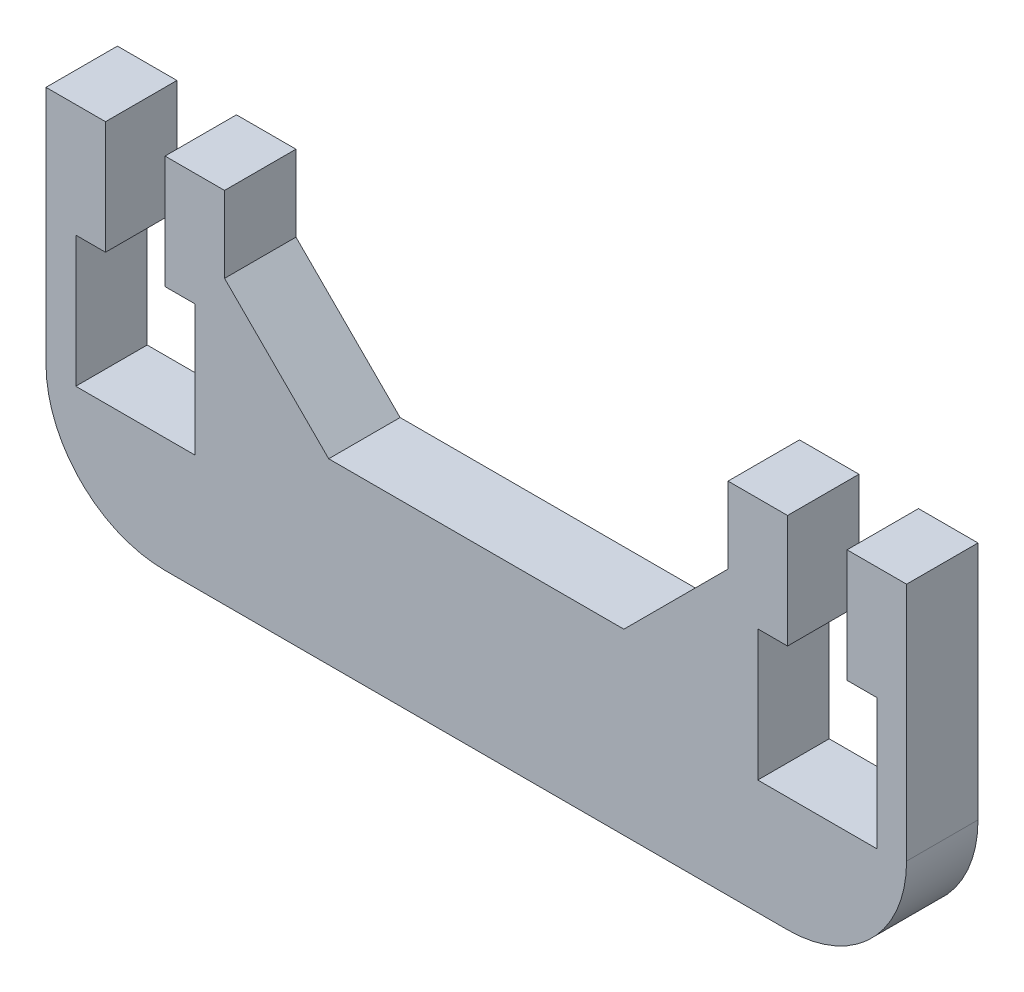
ISO-10303-21;
HEADER;
FILE_DESCRIPTION(('STEP AP214'),'2;1');
FILE_NAME('part.step','',(''),(''),'','','');
FILE_SCHEMA(('AUTOMOTIVE_DESIGN { 1 0 10303 214 1 1 1 1 }'));
ENDSEC;
DATA;
#1=APPLICATION_CONTEXT('core data for automotive mechanical design processes');
#2=APPLICATION_PROTOCOL_DEFINITION('international standard','automotive_design',2000,#1);
#3=PRODUCT_CONTEXT('',#1,'mechanical');
#4=PRODUCT('Part','Part','',(#3));
#5=PRODUCT_RELATED_PRODUCT_CATEGORY('part','',(#4));
#6=PRODUCT_DEFINITION_FORMATION('','',#4);
#7=PRODUCT_DEFINITION_CONTEXT('part definition',#1,'design');
#8=PRODUCT_DEFINITION('design','',#6,#7);
#9=PRODUCT_DEFINITION_SHAPE('','',#8);
#10=(LENGTH_UNIT() NAMED_UNIT(*) SI_UNIT(.MILLI.,.METRE.));
#11=(NAMED_UNIT(*) PLANE_ANGLE_UNIT() SI_UNIT($,.RADIAN.));
#12=(NAMED_UNIT(*) SI_UNIT($,.STERADIAN.) SOLID_ANGLE_UNIT());
#13=UNCERTAINTY_MEASURE_WITH_UNIT(LENGTH_MEASURE(1.E-05),#10,'distance_accuracy_value','');
#14=(GEOMETRIC_REPRESENTATION_CONTEXT(3) GLOBAL_UNCERTAINTY_ASSIGNED_CONTEXT((#13)) GLOBAL_UNIT_ASSIGNED_CONTEXT((#10,
#11,#12)) REPRESENTATION_CONTEXT('',''));
#15=CARTESIAN_POINT('',(0.,0.,0.));
#16=DIRECTION('',(0.,0.,1.));
#17=DIRECTION('',(1.,0.,0.));
#18=AXIS2_PLACEMENT_3D('',#15,#16,#17);
#19=CARTESIAN_POINT('',(0.,0.,6.));
#20=DIRECTION('',(0.,0.,-1.));
#21=DIRECTION('',(-1.,0.,0.));
#22=AXIS2_PLACEMENT_3D('',#19,#20,#21);
#23=PLANE('',#22);
#24=DIRECTION('',(0.,-1.,0.));
#25=VECTOR('',#24,1.);
#26=CARTESIAN_POINT('',(-10.,0.,6.));
#27=LINE('',#26,#25);
#28=CARTESIAN_POINT('',(-10.,15.15,6.));
#29=VERTEX_POINT('',#28);
#30=CARTESIAN_POINT('',(-10.,5.65,6.000005));
#31=VERTEX_POINT('',#30);
#32=EDGE_CURVE('E358',#29,#31,#27,.T.);
#33=ORIENTED_EDGE('',*,*,#32,.F.);
#34=DIRECTION('',(-1.,0.,0.));
#35=VECTOR('',#34,1.);
#36=CARTESIAN_POINT('',(-15.,15.15,6.));
#37=LINE('',#36,#35);
#38=CARTESIAN_POINT('',(-15.,15.15,6.));
#39=VERTEX_POINT('',#38);
#40=EDGE_CURVE('E285',#29,#39,#37,.T.);
#41=ORIENTED_EDGE('',*,*,#40,.T.);
#42=DIRECTION('',(0.,-1.,0.));
#43=VECTOR('',#42,1.);
#44=CARTESIAN_POINT('',(-15.,-15.,6.));
#45=LINE('',#44,#43);
#46=CARTESIAN_POINT('',(-15.,-5.,6.));
#47=VERTEX_POINT('',#46);
#48=EDGE_CURVE('E422',#39,#47,#45,.T.);
#49=ORIENTED_EDGE('',*,*,#48,.T.);
#50=CARTESIAN_POINT('',(-5.,-5.,6.));
#51=DIRECTION('',(0.,0.,-1.));
#52=DIRECTION('',(-1.,0.,0.));
#53=AXIS2_PLACEMENT_3D('',#50,#51,#52);
#54=CIRCLE('',#53,10.);
#55=CARTESIAN_POINT('',(-5.,-15.,6.));
#56=VERTEX_POINT('',#55);
#57=EDGE_CURVE('E341',#47,#56,#54,.F.);
#58=ORIENTED_EDGE('',*,*,#57,.T.);
#59=DIRECTION('',(1.,0.,0.));
#60=VECTOR('',#59,1.);
#61=CARTESIAN_POINT('',(-15.,-15.,6.));
#62=LINE('',#61,#60);
#63=CARTESIAN_POINT('',(47.3,-15.,6.));
#64=VERTEX_POINT('',#63);
#65=EDGE_CURVE('E419',#56,#64,#62,.T.);
#66=ORIENTED_EDGE('',*,*,#65,.T.);
#67=CARTESIAN_POINT('',(47.3,-5.,6.));
#68=DIRECTION('',(0.,0.,-1.));
#69=DIRECTION('',(-1.,0.,0.));
#70=AXIS2_PLACEMENT_3D('',#67,#68,#69);
#71=CIRCLE('',#70,10.);
#72=CARTESIAN_POINT('',(57.3,-5.,6.));
#73=VERTEX_POINT('',#72);
#74=EDGE_CURVE('E343',#64,#73,#71,.F.);
#75=ORIENTED_EDGE('',*,*,#74,.T.);
#76=DIRECTION('',(0.,1.,0.));
#77=VECTOR('',#76,1.);
#78=CARTESIAN_POINT('',(57.3,-15.,6.));
#79=LINE('',#78,#77);
#80=CARTESIAN_POINT('',(57.3,15.15,6.));
#81=VERTEX_POINT('',#80);
#82=EDGE_CURVE('E417',#73,#81,#79,.T.);
#83=ORIENTED_EDGE('',*,*,#82,.T.);
#84=DIRECTION('',(-1.,0.,0.));
#85=VECTOR('',#84,1.);
#86=CARTESIAN_POINT('',(42.3,15.15,6.));
#87=LINE('',#86,#85);
#88=CARTESIAN_POINT('',(52.3,15.15,6.));
#89=VERTEX_POINT('',#88);
#90=EDGE_CURVE('E412',#81,#89,#87,.T.);
#91=ORIENTED_EDGE('',*,*,#90,.T.);
#92=DIRECTION('',(0.,-1.,0.));
#93=VECTOR('',#92,1.);
#94=CARTESIAN_POINT('',(52.3,15.15,6.));
#95=LINE('',#94,#93);
#96=CARTESIAN_POINT('',(52.3,5.65,6.));
#97=VERTEX_POINT('',#96);
#98=EDGE_CURVE('E436',#89,#97,#95,.T.);
#99=ORIENTED_EDGE('',*,*,#98,.T.);
#100=DIRECTION('',(-1.,0.,0.));
#101=VECTOR('',#100,1.);
#102=CARTESIAN_POINT('',(0.,5.65000000000001,6.));
#103=LINE('',#102,#101);
#104=CARTESIAN_POINT('',(54.8,5.65,6.));
#105=VERTEX_POINT('',#104);
#106=EDGE_CURVE('E838',#105,#97,#103,.T.);
#107=ORIENTED_EDGE('',*,*,#106,.F.);
#108=DIRECTION('',(0.,-1.,0.));
#109=VECTOR('',#108,1.);
#110=CARTESIAN_POINT('',(54.8,0.,6.));
#111=LINE('',#110,#109);
#112=CARTESIAN_POINT('',(54.8,-5.35,6.));
#113=VERTEX_POINT('',#112);
#114=EDGE_CURVE('E856',#105,#113,#111,.T.);
#115=ORIENTED_EDGE('',*,*,#114,.T.);
#116=DIRECTION('',(-1.,0.,0.));
#117=VECTOR('',#116,1.);
#118=CARTESIAN_POINT('',(0.,-5.34999999999999,6.));
#119=LINE('',#118,#117);
#120=CARTESIAN_POINT('',(44.8,-5.35,6.));
#121=VERTEX_POINT('',#120);
#122=EDGE_CURVE('E853',#113,#121,#119,.T.);
#123=ORIENTED_EDGE('',*,*,#122,.T.);
#124=DIRECTION('',(0.,-1.,0.));
#125=VECTOR('',#124,1.);
#126=CARTESIAN_POINT('',(44.8,0.,6.));
#127=LINE('',#126,#125);
#128=CARTESIAN_POINT('',(44.8,5.65,6.));
#129=VERTEX_POINT('',#128);
#130=EDGE_CURVE('E847',#129,#121,#127,.T.);
#131=ORIENTED_EDGE('',*,*,#130,.F.);
#132=CARTESIAN_POINT('',(47.3,5.65,6.));
#133=VERTEX_POINT('',#132);
#134=EDGE_CURVE('E461',#133,#129,#103,.T.);
#135=ORIENTED_EDGE('',*,*,#134,.F.);
#136=DIRECTION('',(0.,-1.,0.));
#137=VECTOR('',#136,1.);
#138=CARTESIAN_POINT('',(47.3,15.15,6.));
#139=LINE('',#138,#137);
#140=CARTESIAN_POINT('',(47.3,15.15,6.));
#141=VERTEX_POINT('',#140);
#142=EDGE_CURVE('E432',#141,#133,#139,.T.);
#143=ORIENTED_EDGE('',*,*,#142,.F.);
#144=CARTESIAN_POINT('',(42.3,15.15,6.));
#145=VERTEX_POINT('',#144);
#146=EDGE_CURVE('E410',#141,#145,#87,.T.);
#147=ORIENTED_EDGE('',*,*,#146,.T.);
#148=DIRECTION('',(0.,-1.,0.));
#149=VECTOR('',#148,1.);
#150=CARTESIAN_POINT('',(42.3,0.,6.));
#151=LINE('',#150,#149);
#152=CARTESIAN_POINT('',(42.3,8.74999999999998,6.));
#153=VERTEX_POINT('',#152);
#154=EDGE_CURVE('E407',#145,#153,#151,.T.);
#155=ORIENTED_EDGE('',*,*,#154,.T.);
#156=DIRECTION('',(0.707106781186551,0.707106781186544,0.));
#157=VECTOR('',#156,1.);
#158=CARTESIAN_POINT('',(16.7749999999998,-16.775,6.));
#159=LINE('',#158,#157);
#160=CARTESIAN_POINT('',(33.5499999999999,0.,6.));
#161=VERTEX_POINT('',#160);
#162=EDGE_CURVE('E12',#153,#161,#159,.F.);
#163=ORIENTED_EDGE('',*,*,#162,.T.);
#164=DIRECTION('',(-1.,0.,0.));
#165=VECTOR('',#164,1.);
#166=CARTESIAN_POINT('',(0.,0.,6.));
#167=LINE('',#166,#165);
#168=CARTESIAN_POINT('',(8.74999999999997,0.,6.));
#169=VERTEX_POINT('',#168);
#170=EDGE_CURVE('E321',#161,#169,#167,.T.);
#171=ORIENTED_EDGE('',*,*,#170,.T.);
#172=DIRECTION('',(0.707106781186544,-0.707106781186551,0.));
#173=VECTOR('',#172,1.);
#174=CARTESIAN_POINT('',(4.37500000000003,4.37499999999998,6.));
#175=LINE('',#174,#173);
#176=CARTESIAN_POINT('',(0.,8.75000000000005,6.));
#177=VERTEX_POINT('',#176);
#178=EDGE_CURVE('E384',#169,#177,#175,.F.);
#179=ORIENTED_EDGE('',*,*,#178,.T.);
#180=DIRECTION('',(0.,1.,0.));
#181=VECTOR('',#180,1.);
#182=CARTESIAN_POINT('',(0.,0.,6.));
#183=LINE('',#182,#181);
#184=CARTESIAN_POINT('',(0.,15.15,6.));
#185=VERTEX_POINT('',#184);
#186=EDGE_CURVE('E316',#177,#185,#183,.T.);
#187=ORIENTED_EDGE('',*,*,#186,.T.);
#188=CARTESIAN_POINT('',(-5.,15.15,6.));
#189=VERTEX_POINT('',#188);
#190=EDGE_CURVE('E425',#185,#189,#37,.T.);
#191=ORIENTED_EDGE('',*,*,#190,.T.);
#192=DIRECTION('',(0.,-1.,0.));
#193=VECTOR('',#192,1.);
#194=CARTESIAN_POINT('',(-5.,0.,6.));
#195=LINE('',#194,#193);
#196=CARTESIAN_POINT('',(-5.,5.65,6.000005));
#197=VERTEX_POINT('',#196);
#198=EDGE_CURVE('E354',#189,#197,#195,.T.);
#199=ORIENTED_EDGE('',*,*,#198,.T.);
#200=DIRECTION('',(1.,0.,0.));
#201=VECTOR('',#200,1.);
#202=CARTESIAN_POINT('',(0.,5.65,6.));
#203=LINE('',#202,#201);
#204=CARTESIAN_POINT('',(-2.5,5.65,6.));
#205=VERTEX_POINT('',#204);
#206=EDGE_CURVE('E362',#197,#205,#203,.T.);
#207=ORIENTED_EDGE('',*,*,#206,.T.);
#208=DIRECTION('',(0.,-1.,0.));
#209=VECTOR('',#208,1.);
#210=CARTESIAN_POINT('',(-2.5,0.,6.));
#211=LINE('',#210,#209);
#212=CARTESIAN_POINT('',(-2.5,-5.35,6.));
#213=VERTEX_POINT('',#212);
#214=EDGE_CURVE('E360',#205,#213,#211,.T.);
#215=ORIENTED_EDGE('',*,*,#214,.T.);
#216=DIRECTION('',(1.,0.,0.));
#217=VECTOR('',#216,1.);
#218=CARTESIAN_POINT('',(0.,-5.35,6.));
#219=LINE('',#218,#217);
#220=CARTESIAN_POINT('',(-12.5,-5.35,6.));
#221=VERTEX_POINT('',#220);
#222=EDGE_CURVE('E367',#221,#213,#219,.T.);
#223=ORIENTED_EDGE('',*,*,#222,.F.);
#224=DIRECTION('',(0.,-1.,0.));
#225=VECTOR('',#224,1.);
#226=CARTESIAN_POINT('',(-12.5,0.,6.));
#227=LINE('',#226,#225);
#228=CARTESIAN_POINT('',(-12.5,5.65,6.));
#229=VERTEX_POINT('',#228);
#230=EDGE_CURVE('E365',#229,#221,#227,.T.);
#231=ORIENTED_EDGE('',*,*,#230,.F.);
#232=DIRECTION('',(1.,0.,0.));
#233=VECTOR('',#232,1.);
#234=CARTESIAN_POINT('',(0.,5.65,6.));
#235=LINE('',#234,#233);
#236=EDGE_CURVE('E368',#229,#31,#235,.T.);
#237=ORIENTED_EDGE('',*,*,#236,.T.);
#238=EDGE_LOOP('',(#33,#41,#49,#58,#66,#75,#83,#91,#99,#107,#115,#123,#131,#135,#143,#147,#155,
#163,#171,#179,#187,#191,#199,#207,#215,#223,#231,#237));
#239=FACE_BOUND('',#238,.T.);
#240=ADVANCED_FACE('F83',(#239),#23,.F.);
#241=CARTESIAN_POINT('',(0.,0.,0.));
#242=DIRECTION('',(0.,0.,-1.));
#243=DIRECTION('',(-1.,0.,0.));
#244=AXIS2_PLACEMENT_3D('',#241,#242,#243);
#245=PLANE('',#244);
#246=DIRECTION('',(-1.,0.,0.));
#247=VECTOR('',#246,1.);
#248=CARTESIAN_POINT('',(-15.,15.15,0.));
#249=LINE('',#248,#247);
#250=CARTESIAN_POINT('',(-10.,15.15,0.));
#251=VERTEX_POINT('',#250);
#252=CARTESIAN_POINT('',(-15.,15.15,0.));
#253=VERTEX_POINT('',#252);
#254=EDGE_CURVE('E283',#251,#253,#249,.T.);
#255=ORIENTED_EDGE('',*,*,#254,.F.);
#256=DIRECTION('',(0.,-1.,0.));
#257=VECTOR('',#256,1.);
#258=CARTESIAN_POINT('',(-10.,15.15,0.));
#259=LINE('',#258,#257);
#260=CARTESIAN_POINT('',(-10.,5.65,0.));
#261=VERTEX_POINT('',#260);
#262=EDGE_CURVE('E267',#251,#261,#259,.T.);
#263=ORIENTED_EDGE('',*,*,#262,.T.);
#264=DIRECTION('',(1.,0.,0.));
#265=VECTOR('',#264,1.);
#266=CARTESIAN_POINT('',(42.3,5.65000000000001,0.));
#267=LINE('',#266,#265);
#268=CARTESIAN_POINT('',(-12.5,5.65,0.));
#269=VERTEX_POINT('',#268);
#270=EDGE_CURVE('E527',#269,#261,#267,.T.);
#271=ORIENTED_EDGE('',*,*,#270,.F.);
#272=DIRECTION('',(0.,-1.,0.));
#273=VECTOR('',#272,1.);
#274=CARTESIAN_POINT('',(-12.5,0.,0.));
#275=LINE('',#274,#273);
#276=CARTESIAN_POINT('',(-12.5,-5.35,0.));
#277=VERTEX_POINT('',#276);
#278=EDGE_CURVE('E529',#269,#277,#275,.T.);
#279=ORIENTED_EDGE('',*,*,#278,.T.);
#280=DIRECTION('',(1.,0.,0.));
#281=VECTOR('',#280,1.);
#282=CARTESIAN_POINT('',(42.3,-5.34999999999999,0.));
#283=LINE('',#282,#281);
#284=CARTESIAN_POINT('',(-2.5,-5.35,0.));
#285=VERTEX_POINT('',#284);
#286=EDGE_CURVE('E547',#277,#285,#283,.T.);
#287=ORIENTED_EDGE('',*,*,#286,.T.);
#288=DIRECTION('',(0.,-1.,0.));
#289=VECTOR('',#288,1.);
#290=CARTESIAN_POINT('',(-2.5,0.,0.));
#291=LINE('',#290,#289);
#292=CARTESIAN_POINT('',(-2.5,5.65,0.));
#293=VERTEX_POINT('',#292);
#294=EDGE_CURVE('E545',#293,#285,#291,.T.);
#295=ORIENTED_EDGE('',*,*,#294,.F.);
#296=CARTESIAN_POINT('',(-5.,5.65,0.));
#297=VERTEX_POINT('',#296);
#298=EDGE_CURVE('E515',#297,#293,#267,.T.);
#299=ORIENTED_EDGE('',*,*,#298,.F.);
#300=DIRECTION('',(0.,-1.,0.));
#301=VECTOR('',#300,1.);
#302=CARTESIAN_POINT('',(-5.,15.15,0.));
#303=LINE('',#302,#301);
#304=CARTESIAN_POINT('',(-5.,15.15,0.));
#305=VERTEX_POINT('',#304);
#306=EDGE_CURVE('E277',#305,#297,#303,.T.);
#307=ORIENTED_EDGE('',*,*,#306,.F.);
#308=CARTESIAN_POINT('',(0.,15.15,0.));
#309=VERTEX_POINT('',#308);
#310=EDGE_CURVE('E293',#309,#305,#249,.T.);
#311=ORIENTED_EDGE('',*,*,#310,.F.);
#312=DIRECTION('',(0.,1.,0.));
#313=VECTOR('',#312,1.);
#314=CARTESIAN_POINT('',(0.,0.,0.));
#315=LINE('',#314,#313);
#316=CARTESIAN_POINT('',(0.,8.75000000000005,0.));
#317=VERTEX_POINT('',#316);
#318=EDGE_CURVE('E294',#317,#309,#315,.T.);
#319=ORIENTED_EDGE('',*,*,#318,.F.);
#320=DIRECTION('',(-0.707106781186544,0.707106781186551,0.));
#321=VECTOR('',#320,1.);
#322=CARTESIAN_POINT('',(0.,8.75000000000006,0.));
#323=LINE('',#322,#321);
#324=CARTESIAN_POINT('',(8.74999999999997,0.,0.));
#325=VERTEX_POINT('',#324);
#326=EDGE_CURVE('E382',#317,#325,#323,.F.);
#327=ORIENTED_EDGE('',*,*,#326,.T.);
#328=DIRECTION('',(-1.,0.,0.));
#329=VECTOR('',#328,1.);
#330=CARTESIAN_POINT('',(0.,0.,0.));
#331=LINE('',#330,#329);
#332=CARTESIAN_POINT('',(33.5499999999999,0.,0.));
#333=VERTEX_POINT('',#332);
#334=EDGE_CURVE('E313',#333,#325,#331,.T.);
#335=ORIENTED_EDGE('',*,*,#334,.F.);
#336=DIRECTION('',(-0.707106781186551,-0.707106781186544,0.));
#337=VECTOR('',#336,1.);
#338=CARTESIAN_POINT('',(33.5499999999999,0.,0.));
#339=LINE('',#338,#337);
#340=CARTESIAN_POINT('',(42.3,8.74999999999998,0.));
#341=VERTEX_POINT('',#340);
#342=EDGE_CURVE('E91',#333,#341,#339,.F.);
#343=ORIENTED_EDGE('',*,*,#342,.T.);
#344=DIRECTION('',(0.,-1.,0.));
#345=VECTOR('',#344,1.);
#346=CARTESIAN_POINT('',(42.3,0.,0.));
#347=LINE('',#346,#345);
#348=CARTESIAN_POINT('',(42.3,15.15,0.));
#349=VERTEX_POINT('',#348);
#350=EDGE_CURVE('E311',#349,#341,#347,.T.);
#351=ORIENTED_EDGE('',*,*,#350,.F.);
#352=DIRECTION('',(-1.,0.,0.));
#353=VECTOR('',#352,1.);
#354=CARTESIAN_POINT('',(42.3,15.15,0.));
#355=LINE('',#354,#353);
#356=CARTESIAN_POINT('',(47.3,15.15,0.));
#357=VERTEX_POINT('',#356);
#358=EDGE_CURVE('E307',#357,#349,#355,.T.);
#359=ORIENTED_EDGE('',*,*,#358,.F.);
#360=DIRECTION('',(0.,-1.,0.));
#361=VECTOR('',#360,1.);
#362=CARTESIAN_POINT('',(47.3,15.15,0.));
#363=LINE('',#362,#361);
#364=CARTESIAN_POINT('',(47.3,5.65,0.));
#365=VERTEX_POINT('',#364);
#366=EDGE_CURVE('E433',#357,#365,#363,.T.);
#367=ORIENTED_EDGE('',*,*,#366,.T.);
#368=DIRECTION('',(-1.,0.,0.));
#369=VECTOR('',#368,1.);
#370=CARTESIAN_POINT('',(0.,5.65000000000001,0.));
#371=LINE('',#370,#369);
#372=CARTESIAN_POINT('',(44.8,5.65,0.));
#373=VERTEX_POINT('',#372);
#374=EDGE_CURVE('E829',#365,#373,#371,.T.);
#375=ORIENTED_EDGE('',*,*,#374,.T.);
#376=DIRECTION('',(0.,-1.,0.));
#377=VECTOR('',#376,1.);
#378=CARTESIAN_POINT('',(44.8,0.,0.));
#379=LINE('',#378,#377);
#380=CARTESIAN_POINT('',(44.8,-5.35,0.));
#381=VERTEX_POINT('',#380);
#382=EDGE_CURVE('E451',#373,#381,#379,.T.);
#383=ORIENTED_EDGE('',*,*,#382,.T.);
#384=DIRECTION('',(-1.,0.,0.));
#385=VECTOR('',#384,1.);
#386=CARTESIAN_POINT('',(0.,-5.34999999999999,0.));
#387=LINE('',#386,#385);
#388=CARTESIAN_POINT('',(54.8,-5.35,0.));
#389=VERTEX_POINT('',#388);
#390=EDGE_CURVE('E845',#389,#381,#387,.T.);
#391=ORIENTED_EDGE('',*,*,#390,.F.);
#392=DIRECTION('',(0.,-1.,0.));
#393=VECTOR('',#392,1.);
#394=CARTESIAN_POINT('',(54.8,0.,0.));
#395=LINE('',#394,#393);
#396=CARTESIAN_POINT('',(54.8,5.65,0.));
#397=VERTEX_POINT('',#396);
#398=EDGE_CURVE('E833',#397,#389,#395,.T.);
#399=ORIENTED_EDGE('',*,*,#398,.F.);
#400=CARTESIAN_POINT('',(52.3,5.65,0.));
#401=VERTEX_POINT('',#400);
#402=EDGE_CURVE('E475',#397,#401,#371,.T.);
#403=ORIENTED_EDGE('',*,*,#402,.T.);
#404=DIRECTION('',(0.,-1.,0.));
#405=VECTOR('',#404,1.);
#406=CARTESIAN_POINT('',(52.3,15.15,0.));
#407=LINE('',#406,#405);
#408=CARTESIAN_POINT('',(52.3,15.15,0.));
#409=VERTEX_POINT('',#408);
#410=EDGE_CURVE('E429',#409,#401,#407,.T.);
#411=ORIENTED_EDGE('',*,*,#410,.F.);
#412=CARTESIAN_POINT('',(57.3,15.15,0.));
#413=VERTEX_POINT('',#412);
#414=EDGE_CURVE('E308',#413,#409,#355,.T.);
#415=ORIENTED_EDGE('',*,*,#414,.F.);
#416=DIRECTION('',(0.,1.,0.));
#417=VECTOR('',#416,1.);
#418=CARTESIAN_POINT('',(57.3,-15.,0.));
#419=LINE('',#418,#417);
#420=CARTESIAN_POINT('',(57.3,-5.,0.));
#421=VERTEX_POINT('',#420);
#422=EDGE_CURVE('E305',#421,#413,#419,.T.);
#423=ORIENTED_EDGE('',*,*,#422,.F.);
#424=CARTESIAN_POINT('',(47.3,-5.,0.));
#425=DIRECTION('',(0.,0.,-1.));
#426=DIRECTION('',(-1.,0.,0.));
#427=AXIS2_PLACEMENT_3D('',#424,#425,#426);
#428=CIRCLE('',#427,10.);
#429=CARTESIAN_POINT('',(47.3,-15.,0.));
#430=VERTEX_POINT('',#429);
#431=EDGE_CURVE('E334',#421,#430,#428,.T.);
#432=ORIENTED_EDGE('',*,*,#431,.T.);
#433=DIRECTION('',(1.,0.,0.));
#434=VECTOR('',#433,1.);
#435=CARTESIAN_POINT('',(-15.,-15.,0.));
#436=LINE('',#435,#434);
#437=CARTESIAN_POINT('',(-5.,-15.,0.));
#438=VERTEX_POINT('',#437);
#439=EDGE_CURVE('E302',#438,#430,#436,.T.);
#440=ORIENTED_EDGE('',*,*,#439,.F.);
#441=CARTESIAN_POINT('',(-5.,-5.,0.));
#442=DIRECTION('',(0.,0.,-1.));
#443=DIRECTION('',(-1.,0.,0.));
#444=AXIS2_PLACEMENT_3D('',#441,#442,#443);
#445=CIRCLE('',#444,10.);
#446=CARTESIAN_POINT('',(-15.,-5.,0.));
#447=VERTEX_POINT('',#446);
#448=EDGE_CURVE('E332',#438,#447,#445,.T.);
#449=ORIENTED_EDGE('',*,*,#448,.T.);
#450=DIRECTION('',(0.,-1.,0.));
#451=VECTOR('',#450,1.);
#452=CARTESIAN_POINT('',(-15.,-15.,0.));
#453=LINE('',#452,#451);
#454=EDGE_CURVE('E292',#253,#447,#453,.T.);
#455=ORIENTED_EDGE('',*,*,#454,.F.);
#456=EDGE_LOOP('',(#255,#263,#271,#279,#287,#295,#299,#307,#311,#319,#327,#335,#343,#351,#359,
#367,#375,#383,#391,#399,#403,#411,#415,#423,#432,#440,#449,#455));
#457=FACE_BOUND('',#456,.T.);
#458=ADVANCED_FACE('F290',(#457),#245,.T.);
#459=CARTESIAN_POINT('',(-15.,15.15,6.));
#460=DIRECTION('',(0.,-1.,0.));
#461=DIRECTION('',(0.,0.,-1.));
#462=AXIS2_PLACEMENT_3D('',#459,#460,#461);
#463=PLANE('',#462);
#464=DIRECTION('',(0.,0.,1.));
#465=VECTOR('',#464,1.);
#466=CARTESIAN_POINT('',(-10.,15.15,6.));
#467=LINE('',#466,#465);
#468=EDGE_CURVE('E271',#251,#29,#467,.T.);
#469=ORIENTED_EDGE('',*,*,#468,.F.);
#470=ORIENTED_EDGE('',*,*,#254,.T.);
#471=DIRECTION('',(0.,0.,-1.));
#472=VECTOR('',#471,1.);
#473=CARTESIAN_POINT('',(-15.,15.15,6.));
#474=LINE('',#473,#472);
#475=EDGE_CURVE('E324',#39,#253,#474,.T.);
#476=ORIENTED_EDGE('',*,*,#475,.F.);
#477=ORIENTED_EDGE('',*,*,#40,.F.);
#478=EDGE_LOOP('',(#469,#470,#476,#477));
#479=FACE_BOUND('',#478,.T.);
#480=ADVANCED_FACE('F281',(#479),#463,.F.);
#481=CARTESIAN_POINT('',(42.3,15.15,6.));
#482=DIRECTION('',(0.,-1.,0.));
#483=DIRECTION('',(0.,0.,-1.));
#484=AXIS2_PLACEMENT_3D('',#481,#482,#483);
#485=PLANE('',#484);
#486=DIRECTION('',(0.,0.,-1.));
#487=VECTOR('',#486,1.);
#488=CARTESIAN_POINT('',(47.3,15.15,6.));
#489=LINE('',#488,#487);
#490=EDGE_CURVE('E448',#141,#357,#489,.T.);
#491=ORIENTED_EDGE('',*,*,#490,.T.);
#492=ORIENTED_EDGE('',*,*,#358,.T.);
#493=DIRECTION('',(0.,0.,-1.));
#494=VECTOR('',#493,1.);
#495=CARTESIAN_POINT('',(42.3,15.15,6.));
#496=LINE('',#495,#494);
#497=EDGE_CURVE('E317',#145,#349,#496,.T.);
#498=ORIENTED_EDGE('',*,*,#497,.F.);
#499=ORIENTED_EDGE('',*,*,#146,.F.);
#500=EDGE_LOOP('',(#491,#492,#498,#499));
#501=FACE_BOUND('',#500,.T.);
#502=ADVANCED_FACE('F586',(#501),#485,.F.);
#503=CARTESIAN_POINT('',(0.,0.,6.));
#504=DIRECTION('',(-1.,0.,0.));
#505=DIRECTION('',(0.,0.,1.));
#506=AXIS2_PLACEMENT_3D('',#503,#504,#505);
#507=PLANE('',#506);
#508=ORIENTED_EDGE('',*,*,#186,.F.);
#509=DIRECTION('',(0.,0.,-1.));
#510=VECTOR('',#509,1.);
#511=CARTESIAN_POINT('',(0.,8.75000000000006,0.));
#512=LINE('',#511,#510);
#513=EDGE_CURVE('E286',#177,#317,#512,.T.);
#514=ORIENTED_EDGE('',*,*,#513,.T.);
#515=ORIENTED_EDGE('',*,*,#318,.T.);
#516=DIRECTION('',(0.,0.,-1.));
#517=VECTOR('',#516,1.);
#518=CARTESIAN_POINT('',(0.,15.15,6.));
#519=LINE('',#518,#517);
#520=EDGE_CURVE('E326',#185,#309,#519,.T.);
#521=ORIENTED_EDGE('',*,*,#520,.F.);
#522=EDGE_LOOP('',(#508,#514,#515,#521));
#523=FACE_BOUND('',#522,.T.);
#524=ADVANCED_FACE('F397',(#523),#507,.F.);
#525=ORIENTED_EDGE('',*,*,#310,.T.);
#526=DIRECTION('',(0.,0.,1.));
#527=VECTOR('',#526,1.);
#528=CARTESIAN_POINT('',(-5.,15.15,6.));
#529=LINE('',#528,#527);
#530=EDGE_CURVE('E287',#305,#189,#529,.T.);
#531=ORIENTED_EDGE('',*,*,#530,.T.);
#532=ORIENTED_EDGE('',*,*,#190,.F.);
#533=ORIENTED_EDGE('',*,*,#520,.T.);
#534=EDGE_LOOP('',(#525,#531,#532,#533));
#535=FACE_BOUND('',#534,.T.);
#536=ADVANCED_FACE('F560',(#535),#463,.F.);
#537=CARTESIAN_POINT('',(-15.,-15.,6.));
#538=DIRECTION('',(1.,0.,0.));
#539=DIRECTION('',(0.,0.,-1.));
#540=AXIS2_PLACEMENT_3D('',#537,#538,#539);
#541=PLANE('',#540);
#542=ORIENTED_EDGE('',*,*,#454,.T.);
#543=DIRECTION('',(0.,0.,-1.));
#544=VECTOR('',#543,1.);
#545=CARTESIAN_POINT('',(-15.,-5.,6.));
#546=LINE('',#545,#544);
#547=EDGE_CURVE('E345',#447,#47,#546,.F.);
#548=ORIENTED_EDGE('',*,*,#547,.T.);
#549=ORIENTED_EDGE('',*,*,#48,.F.);
#550=ORIENTED_EDGE('',*,*,#475,.T.);
#551=EDGE_LOOP('',(#542,#548,#549,#550));
#552=FACE_BOUND('',#551,.T.);
#553=ADVANCED_FACE('F496',(#552),#541,.F.);
#554=CARTESIAN_POINT('',(-15.,-15.,6.));
#555=DIRECTION('',(0.,1.,0.));
#556=DIRECTION('',(0.,0.,1.));
#557=AXIS2_PLACEMENT_3D('',#554,#555,#556);
#558=PLANE('',#557);
#559=ORIENTED_EDGE('',*,*,#439,.T.);
#560=DIRECTION('',(0.,0.,-1.));
#561=VECTOR('',#560,1.);
#562=CARTESIAN_POINT('',(47.3,-15.,6.));
#563=LINE('',#562,#561);
#564=EDGE_CURVE('E339',#430,#64,#563,.F.);
#565=ORIENTED_EDGE('',*,*,#564,.T.);
#566=ORIENTED_EDGE('',*,*,#65,.F.);
#567=DIRECTION('',(0.,0.,-1.));
#568=VECTOR('',#567,1.);
#569=CARTESIAN_POINT('',(-5.,-15.,6.));
#570=LINE('',#569,#568);
#571=EDGE_CURVE('E336',#56,#438,#570,.T.);
#572=ORIENTED_EDGE('',*,*,#571,.T.);
#573=EDGE_LOOP('',(#559,#565,#566,#572));
#574=FACE_BOUND('',#573,.T.);
#575=ADVANCED_FACE('F486',(#574),#558,.F.);
#576=CARTESIAN_POINT('',(57.3,-15.,6.));
#577=DIRECTION('',(-1.,0.,0.));
#578=DIRECTION('',(0.,0.,1.));
#579=AXIS2_PLACEMENT_3D('',#576,#577,#578);
#580=PLANE('',#579);
#581=ORIENTED_EDGE('',*,*,#82,.F.);
#582=DIRECTION('',(0.,0.,-1.));
#583=VECTOR('',#582,1.);
#584=CARTESIAN_POINT('',(57.3,-5.,6.));
#585=LINE('',#584,#583);
#586=EDGE_CURVE('E329',#73,#421,#585,.T.);
#587=ORIENTED_EDGE('',*,*,#586,.T.);
#588=ORIENTED_EDGE('',*,*,#422,.T.);
#589=DIRECTION('',(0.,0.,-1.));
#590=VECTOR('',#589,1.);
#591=CARTESIAN_POINT('',(57.3,15.15,6.));
#592=LINE('',#591,#590);
#593=EDGE_CURVE('E320',#81,#413,#592,.T.);
#594=ORIENTED_EDGE('',*,*,#593,.F.);
#595=EDGE_LOOP('',(#581,#587,#588,#594));
#596=FACE_BOUND('',#595,.T.);
#597=ADVANCED_FACE('F480',(#596),#580,.F.);
#598=ORIENTED_EDGE('',*,*,#414,.T.);
#599=DIRECTION('',(0.,0.,-1.));
#600=VECTOR('',#599,1.);
#601=CARTESIAN_POINT('',(52.3,15.15,6.));
#602=LINE('',#601,#600);
#603=EDGE_CURVE('E439',#89,#409,#602,.T.);
#604=ORIENTED_EDGE('',*,*,#603,.F.);
#605=ORIENTED_EDGE('',*,*,#90,.F.);
#606=ORIENTED_EDGE('',*,*,#593,.T.);
#607=EDGE_LOOP('',(#598,#604,#605,#606));
#608=FACE_BOUND('',#607,.T.);
#609=ADVANCED_FACE('F476',(#608),#485,.F.);
#610=CARTESIAN_POINT('',(42.3,0.,6.));
#611=DIRECTION('',(1.,0.,0.));
#612=DIRECTION('',(0.,0.,-1.));
#613=AXIS2_PLACEMENT_3D('',#610,#611,#612);
#614=PLANE('',#613);
#615=ORIENTED_EDGE('',*,*,#350,.T.);
#616=DIRECTION('',(0.,0.,1.));
#617=VECTOR('',#616,1.);
#618=CARTESIAN_POINT('',(42.3,8.74999999999999,6.));
#619=LINE('',#618,#617);
#620=EDGE_CURVE('E98',#341,#153,#619,.T.);
#621=ORIENTED_EDGE('',*,*,#620,.T.);
#622=ORIENTED_EDGE('',*,*,#154,.F.);
#623=ORIENTED_EDGE('',*,*,#497,.T.);
#624=EDGE_LOOP('',(#615,#621,#622,#623));
#625=FACE_BOUND('',#624,.T.);
#626=ADVANCED_FACE('F581',(#625),#614,.F.);
#627=CARTESIAN_POINT('',(0.,0.,6.));
#628=DIRECTION('',(0.,-1.,0.));
#629=DIRECTION('',(0.,0.,-1.));
#630=AXIS2_PLACEMENT_3D('',#627,#628,#629);
#631=PLANE('',#630);
#632=ORIENTED_EDGE('',*,*,#334,.T.);
#633=DIRECTION('',(0.,0.,1.));
#634=VECTOR('',#633,1.);
#635=CARTESIAN_POINT('',(8.74999999999997,0.,6.));
#636=LINE('',#635,#634);
#637=EDGE_CURVE('E379',#325,#169,#636,.T.);
#638=ORIENTED_EDGE('',*,*,#637,.T.);
#639=ORIENTED_EDGE('',*,*,#170,.F.);
#640=DIRECTION('',(0.,0.,-1.));
#641=VECTOR('',#640,1.);
#642=CARTESIAN_POINT('',(33.5499999999999,0.,0.));
#643=LINE('',#642,#641);
#644=EDGE_CURVE('E376',#161,#333,#643,.T.);
#645=ORIENTED_EDGE('',*,*,#644,.T.);
#646=EDGE_LOOP('',(#632,#638,#639,#645));
#647=FACE_BOUND('',#646,.T.);
#648=ADVANCED_FACE('F403',(#647),#631,.F.);
#649=CARTESIAN_POINT('',(47.3,-5.,6.));
#650=DIRECTION('',(0.,0.,-1.));
#651=DIRECTION('',(-1.,0.,0.));
#652=AXIS2_PLACEMENT_3D('',#649,#650,#651);
#653=CYLINDRICAL_SURFACE('',#652,10.);
#654=ORIENTED_EDGE('',*,*,#74,.F.);
#655=ORIENTED_EDGE('',*,*,#564,.F.);
#656=ORIENTED_EDGE('',*,*,#431,.F.);
#657=ORIENTED_EDGE('',*,*,#586,.F.);
#658=EDGE_LOOP('',(#654,#655,#656,#657));
#659=FACE_BOUND('',#658,.T.);
#660=ADVANCED_FACE('F490',(#659),#653,.T.);
#661=CARTESIAN_POINT('',(-5.,-5.,6.));
#662=DIRECTION('',(0.,0.,-1.));
#663=DIRECTION('',(-1.,0.,0.));
#664=AXIS2_PLACEMENT_3D('',#661,#662,#663);
#665=CYLINDRICAL_SURFACE('',#664,10.);
#666=ORIENTED_EDGE('',*,*,#57,.F.);
#667=ORIENTED_EDGE('',*,*,#547,.F.);
#668=ORIENTED_EDGE('',*,*,#448,.F.);
#669=ORIENTED_EDGE('',*,*,#571,.F.);
#670=EDGE_LOOP('',(#666,#667,#668,#669));
#671=FACE_BOUND('',#670,.T.);
#672=ADVANCED_FACE('F493',(#671),#665,.T.);
#673=CARTESIAN_POINT('',(0.,-5.34999999999999,6.));
#674=DIRECTION('',(0.,-1.,0.));
#675=DIRECTION('',(1.,0.,0.));
#676=AXIS2_PLACEMENT_3D('',#673,#674,#675);
#677=PLANE('',#676);
#678=ORIENTED_EDGE('',*,*,#390,.T.);
#679=DIRECTION('',(0.,0.,-1.));
#680=VECTOR('',#679,1.);
#681=CARTESIAN_POINT('',(44.8,-5.35,6.));
#682=LINE('',#681,#680);
#683=EDGE_CURVE('E460',#121,#381,#682,.T.);
#684=ORIENTED_EDGE('',*,*,#683,.F.);
#685=ORIENTED_EDGE('',*,*,#122,.F.);
#686=DIRECTION('',(0.,0.,-1.));
#687=VECTOR('',#686,1.);
#688=CARTESIAN_POINT('',(54.8,-5.35,6.));
#689=LINE('',#688,#687);
#690=EDGE_CURVE('E849',#113,#389,#689,.T.);
#691=ORIENTED_EDGE('',*,*,#690,.T.);
#692=EDGE_LOOP('',(#678,#684,#685,#691));
#693=FACE_BOUND('',#692,.T.);
#694=ADVANCED_FACE('F600',(#693),#677,.F.);
#695=CARTESIAN_POINT('',(54.8,0.,6.));
#696=DIRECTION('',(1.,0.,0.));
#697=DIRECTION('',(0.,0.,-1.));
#698=AXIS2_PLACEMENT_3D('',#695,#696,#697);
#699=PLANE('',#698);
#700=ORIENTED_EDGE('',*,*,#398,.T.);
#701=ORIENTED_EDGE('',*,*,#690,.F.);
#702=ORIENTED_EDGE('',*,*,#114,.F.);
#703=DIRECTION('',(0.,0.,-1.));
#704=VECTOR('',#703,1.);
#705=CARTESIAN_POINT('',(54.8,5.65,6.));
#706=LINE('',#705,#704);
#707=EDGE_CURVE('E851',#105,#397,#706,.T.);
#708=ORIENTED_EDGE('',*,*,#707,.T.);
#709=EDGE_LOOP('',(#700,#701,#702,#708));
#710=FACE_BOUND('',#709,.T.);
#711=ADVANCED_FACE('F604',(#710),#699,.F.);
#712=CARTESIAN_POINT('',(44.8,0.,6.));
#713=DIRECTION('',(1.,0.,0.));
#714=DIRECTION('',(0.,1.,0.));
#715=AXIS2_PLACEMENT_3D('',#712,#713,#714);
#716=PLANE('',#715);
#717=ORIENTED_EDGE('',*,*,#382,.F.);
#718=DIRECTION('',(0.,0.,-1.));
#719=VECTOR('',#718,1.);
#720=CARTESIAN_POINT('',(44.8,5.65,6.));
#721=LINE('',#720,#719);
#722=EDGE_CURVE('E852',#129,#373,#721,.T.);
#723=ORIENTED_EDGE('',*,*,#722,.F.);
#724=ORIENTED_EDGE('',*,*,#130,.T.);
#725=ORIENTED_EDGE('',*,*,#683,.T.);
#726=EDGE_LOOP('',(#717,#723,#724,#725));
#727=FACE_BOUND('',#726,.T.);
#728=ADVANCED_FACE('F610',(#727),#716,.T.);
#729=CARTESIAN_POINT('',(0.,5.65000000000001,6.));
#730=DIRECTION('',(0.,-1.,0.));
#731=DIRECTION('',(1.,0.,0.));
#732=AXIS2_PLACEMENT_3D('',#729,#730,#731);
#733=PLANE('',#732);
#734=ORIENTED_EDGE('',*,*,#134,.T.);
#735=ORIENTED_EDGE('',*,*,#722,.T.);
#736=ORIENTED_EDGE('',*,*,#374,.F.);
#737=DIRECTION('',(0.,0.,-1.));
#738=VECTOR('',#737,1.);
#739=CARTESIAN_POINT('',(47.3,5.65,6.));
#740=LINE('',#739,#738);
#741=EDGE_CURVE('E457',#133,#365,#740,.T.);
#742=ORIENTED_EDGE('',*,*,#741,.F.);
#743=EDGE_LOOP('',(#734,#735,#736,#742));
#744=FACE_BOUND('',#743,.T.);
#745=ADVANCED_FACE('F617',(#744),#733,.T.);
#746=DIRECTION('',(0.,0.,-1.));
#747=VECTOR('',#746,1.);
#748=CARTESIAN_POINT('',(52.3,5.65,6.));
#749=LINE('',#748,#747);
#750=EDGE_CURVE('E297',#97,#401,#749,.T.);
#751=ORIENTED_EDGE('',*,*,#750,.T.);
#752=ORIENTED_EDGE('',*,*,#402,.F.);
#753=ORIENTED_EDGE('',*,*,#707,.F.);
#754=ORIENTED_EDGE('',*,*,#106,.T.);
#755=EDGE_LOOP('',(#751,#752,#753,#754));
#756=FACE_BOUND('',#755,.T.);
#757=ADVANCED_FACE('F620',(#756),#733,.T.);
#758=CARTESIAN_POINT('',(47.3,15.15,6.));
#759=DIRECTION('',(1.,0.,0.));
#760=DIRECTION('',(0.,0.,-1.));
#761=AXIS2_PLACEMENT_3D('',#758,#759,#760);
#762=PLANE('',#761);
#763=ORIENTED_EDGE('',*,*,#366,.F.);
#764=ORIENTED_EDGE('',*,*,#490,.F.);
#765=ORIENTED_EDGE('',*,*,#142,.T.);
#766=ORIENTED_EDGE('',*,*,#741,.T.);
#767=EDGE_LOOP('',(#763,#764,#765,#766));
#768=FACE_BOUND('',#767,.T.);
#769=ADVANCED_FACE('F576',(#768),#762,.T.);
#770=CARTESIAN_POINT('',(52.3,15.15,6.));
#771=DIRECTION('',(1.,0.,0.));
#772=DIRECTION('',(0.,0.,-1.));
#773=AXIS2_PLACEMENT_3D('',#770,#771,#772);
#774=PLANE('',#773);
#775=ORIENTED_EDGE('',*,*,#410,.T.);
#776=ORIENTED_EDGE('',*,*,#750,.F.);
#777=ORIENTED_EDGE('',*,*,#98,.F.);
#778=ORIENTED_EDGE('',*,*,#603,.T.);
#779=EDGE_LOOP('',(#775,#776,#777,#778));
#780=FACE_BOUND('',#779,.T.);
#781=ADVANCED_FACE('F467',(#780),#774,.F.);
#782=CARTESIAN_POINT('',(42.3,5.65000000000001,6.00005));
#783=DIRECTION('',(0.,1.,0.));
#784=DIRECTION('',(-1.,0.,0.));
#785=AXIS2_PLACEMENT_3D('',#782,#783,#784);
#786=PLANE('',#785);
#787=DIRECTION('',(0.,0.,-1.));
#788=VECTOR('',#787,1.);
#789=CARTESIAN_POINT('',(-12.5,5.65,6.00005));
#790=LINE('',#789,#788);
#791=EDGE_CURVE('E517',#229,#269,#790,.T.);
#792=ORIENTED_EDGE('',*,*,#791,.T.);
#793=ORIENTED_EDGE('',*,*,#270,.T.);
#794=DIRECTION('',(0.,0.,-1.));
#795=VECTOR('',#794,1.);
#796=CARTESIAN_POINT('',(-10.,5.65,6.00005));
#797=LINE('',#796,#795);
#798=EDGE_CURVE('E273',#31,#261,#797,.T.);
#799=ORIENTED_EDGE('',*,*,#798,.F.);
#800=ORIENTED_EDGE('',*,*,#236,.F.);
#801=EDGE_LOOP('',(#792,#793,#799,#800));
#802=FACE_BOUND('',#801,.T.);
#803=ADVANCED_FACE('F625',(#802),#786,.F.);
#804=CARTESIAN_POINT('',(-2.5,0.,6.00005));
#805=DIRECTION('',(1.,0.,0.));
#806=DIRECTION('',(0.,1.,0.));
#807=AXIS2_PLACEMENT_3D('',#804,#805,#806);
#808=PLANE('',#807);
#809=DIRECTION('',(0.,0.,-1.));
#810=VECTOR('',#809,1.);
#811=CARTESIAN_POINT('',(-2.5,5.65,6.00005));
#812=LINE('',#811,#810);
#813=EDGE_CURVE('E359',#205,#293,#812,.T.);
#814=ORIENTED_EDGE('',*,*,#813,.T.);
#815=ORIENTED_EDGE('',*,*,#294,.T.);
#816=DIRECTION('',(0.,0.,-1.));
#817=VECTOR('',#816,1.);
#818=CARTESIAN_POINT('',(-2.5,-5.35,6.00005));
#819=LINE('',#818,#817);
#820=EDGE_CURVE('E511',#213,#285,#819,.T.);
#821=ORIENTED_EDGE('',*,*,#820,.F.);
#822=ORIENTED_EDGE('',*,*,#214,.F.);
#823=EDGE_LOOP('',(#814,#815,#821,#822));
#824=FACE_BOUND('',#823,.T.);
#825=ADVANCED_FACE('F508',(#824),#808,.F.);
#826=DIRECTION('',(0.,0.,-1.));
#827=VECTOR('',#826,1.);
#828=CARTESIAN_POINT('',(-5.,5.65,6.00005));
#829=LINE('',#828,#827);
#830=EDGE_CURVE('E535',#197,#297,#829,.T.);
#831=ORIENTED_EDGE('',*,*,#830,.T.);
#832=ORIENTED_EDGE('',*,*,#298,.T.);
#833=ORIENTED_EDGE('',*,*,#813,.F.);
#834=ORIENTED_EDGE('',*,*,#206,.F.);
#835=EDGE_LOOP('',(#831,#832,#833,#834));
#836=FACE_BOUND('',#835,.T.);
#837=ADVANCED_FACE('F513',(#836),#786,.F.);
#838=CARTESIAN_POINT('',(-12.5,0.,6.00005));
#839=DIRECTION('',(1.,0.,0.));
#840=DIRECTION('',(0.,0.,-1.));
#841=AXIS2_PLACEMENT_3D('',#838,#839,#840);
#842=PLANE('',#841);
#843=ORIENTED_EDGE('',*,*,#230,.T.);
#844=DIRECTION('',(0.,0.,-1.));
#845=VECTOR('',#844,1.);
#846=CARTESIAN_POINT('',(-12.5,-5.35,6.00005));
#847=LINE('',#846,#845);
#848=EDGE_CURVE('E519',#221,#277,#847,.T.);
#849=ORIENTED_EDGE('',*,*,#848,.T.);
#850=ORIENTED_EDGE('',*,*,#278,.F.);
#851=ORIENTED_EDGE('',*,*,#791,.F.);
#852=EDGE_LOOP('',(#843,#849,#850,#851));
#853=FACE_BOUND('',#852,.T.);
#854=ADVANCED_FACE('F553',(#853),#842,.T.);
#855=CARTESIAN_POINT('',(42.3,-5.34999999999999,6.00005));
#856=DIRECTION('',(0.,1.,0.));
#857=DIRECTION('',(-1.,0.,0.));
#858=AXIS2_PLACEMENT_3D('',#855,#856,#857);
#859=PLANE('',#858);
#860=ORIENTED_EDGE('',*,*,#222,.T.);
#861=ORIENTED_EDGE('',*,*,#820,.T.);
#862=ORIENTED_EDGE('',*,*,#286,.F.);
#863=ORIENTED_EDGE('',*,*,#848,.F.);
#864=EDGE_LOOP('',(#860,#861,#862,#863));
#865=FACE_BOUND('',#864,.T.);
#866=ADVANCED_FACE('F556',(#865),#859,.T.);
#867=CARTESIAN_POINT('',(-10.,15.15,6.00005));
#868=DIRECTION('',(1.,0.,0.));
#869=DIRECTION('',(0.,0.,-1.));
#870=AXIS2_PLACEMENT_3D('',#867,#868,#869);
#871=PLANE('',#870);
#872=ORIENTED_EDGE('',*,*,#32,.T.);
#873=ORIENTED_EDGE('',*,*,#798,.T.);
#874=ORIENTED_EDGE('',*,*,#262,.F.);
#875=ORIENTED_EDGE('',*,*,#468,.T.);
#876=EDGE_LOOP('',(#872,#873,#874,#875));
#877=FACE_BOUND('',#876,.T.);
#878=ADVANCED_FACE('F270',(#877),#871,.T.);
#879=CARTESIAN_POINT('',(-5.,15.15,6.00005));
#880=DIRECTION('',(1.,0.,0.));
#881=DIRECTION('',(0.,0.,-1.));
#882=AXIS2_PLACEMENT_3D('',#879,#880,#881);
#883=PLANE('',#882);
#884=ORIENTED_EDGE('',*,*,#530,.F.);
#885=ORIENTED_EDGE('',*,*,#306,.T.);
#886=ORIENTED_EDGE('',*,*,#830,.F.);
#887=ORIENTED_EDGE('',*,*,#198,.F.);
#888=EDGE_LOOP('',(#884,#885,#886,#887));
#889=FACE_BOUND('',#888,.T.);
#890=ADVANCED_FACE('F561',(#889),#883,.F.);
#891=CARTESIAN_POINT('',(0.,8.75000000000006,6.));
#892=DIRECTION('',(0.707106781186551,0.707106781186544,0.));
#893=DIRECTION('',(0.,0.,1.));
#894=AXIS2_PLACEMENT_3D('',#891,#892,#893);
#895=PLANE('',#894);
#896=ORIENTED_EDGE('',*,*,#178,.F.);
#897=ORIENTED_EDGE('',*,*,#637,.F.);
#898=ORIENTED_EDGE('',*,*,#326,.F.);
#899=ORIENTED_EDGE('',*,*,#513,.F.);
#900=EDGE_LOOP('',(#896,#897,#898,#899));
#901=FACE_BOUND('',#900,.T.);
#902=ADVANCED_FACE('F400',(#901),#895,.T.);
#903=CARTESIAN_POINT('',(33.5499999999999,0.,6.));
#904=DIRECTION('',(-0.707106781186544,0.707106781186551,0.));
#905=DIRECTION('',(0.,0.,1.));
#906=AXIS2_PLACEMENT_3D('',#903,#904,#905);
#907=PLANE('',#906);
#908=ORIENTED_EDGE('',*,*,#162,.F.);
#909=ORIENTED_EDGE('',*,*,#620,.F.);
#910=ORIENTED_EDGE('',*,*,#342,.F.);
#911=ORIENTED_EDGE('',*,*,#644,.F.);
#912=EDGE_LOOP('',(#908,#909,#910,#911));
#913=FACE_BOUND('',#912,.T.);
#914=ADVANCED_FACE('F85',(#913),#907,.T.);
#915=CLOSED_SHELL('',(#240,#458,#480,#502,#524,#536,#553,#575,#597,#609,#626,#648,#660,#672,
#694,#711,#728,#745,#757,#769,#781,#803,#825,#837,#854,#866,#878,#890,#902,#914));
#916=MANIFOLD_SOLID_BREP('B2',#915);
#917=ADVANCED_BREP_SHAPE_REPRESENTATION('',(#18,#916),#14);
#918=SHAPE_DEFINITION_REPRESENTATION(#9,#917);
ENDSEC;
END-ISO-10303-21;
